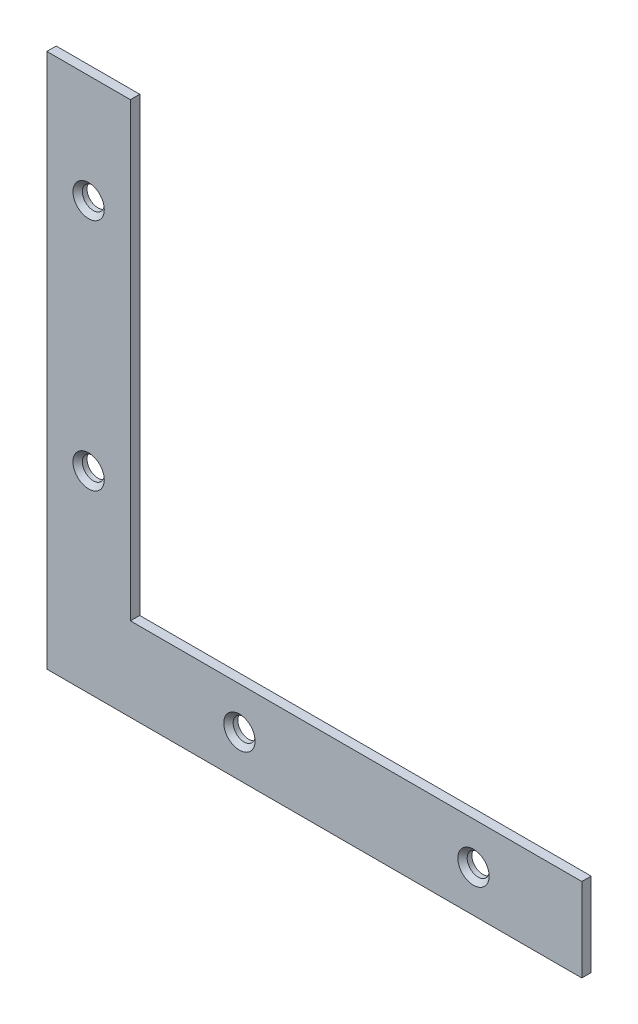
ISO-10303-21;
HEADER;
FILE_DESCRIPTION(('STEP AP214'),'2;1');
FILE_NAME('part.step','',(''),(''),'','','');
FILE_SCHEMA(('AUTOMOTIVE_DESIGN { 1 0 10303 214 1 1 1 1 }'));
ENDSEC;
DATA;
#1=APPLICATION_CONTEXT('core data for automotive mechanical design processes');
#2=APPLICATION_PROTOCOL_DEFINITION('international standard','automotive_design',2000,#1);
#3=PRODUCT_CONTEXT('',#1,'mechanical');
#4=PRODUCT('Part','Part','',(#3));
#5=PRODUCT_RELATED_PRODUCT_CATEGORY('part','',(#4));
#6=PRODUCT_DEFINITION_FORMATION('','',#4);
#7=PRODUCT_DEFINITION_CONTEXT('part definition',#1,'design');
#8=PRODUCT_DEFINITION('design','',#6,#7);
#9=PRODUCT_DEFINITION_SHAPE('','',#8);
#10=(LENGTH_UNIT() NAMED_UNIT(*) SI_UNIT(.MILLI.,.METRE.));
#11=(NAMED_UNIT(*) PLANE_ANGLE_UNIT() SI_UNIT($,.RADIAN.));
#12=(NAMED_UNIT(*) SI_UNIT($,.STERADIAN.) SOLID_ANGLE_UNIT());
#13=UNCERTAINTY_MEASURE_WITH_UNIT(LENGTH_MEASURE(1.E-05),#10,'distance_accuracy_value','');
#14=(GEOMETRIC_REPRESENTATION_CONTEXT(3) GLOBAL_UNCERTAINTY_ASSIGNED_CONTEXT((#13)) GLOBAL_UNIT_ASSIGNED_CONTEXT((#10,
#11,#12)) REPRESENTATION_CONTEXT('',''));
#15=CARTESIAN_POINT('',(0.,0.,0.));
#16=DIRECTION('',(0.,0.,1.));
#17=DIRECTION('',(1.,0.,0.));
#18=AXIS2_PLACEMENT_3D('',#15,#16,#17);
#19=CARTESIAN_POINT('',(0.,101.6,0.889));
#20=DIRECTION('',(0.,0.,1.));
#21=DIRECTION('',(1.,0.,0.));
#22=AXIS2_PLACEMENT_3D('',#19,#20,#21);
#23=PLANE('',#22);
#24=CARTESIAN_POINT('',(7.93749999999997,81.026,0.889));
#25=DIRECTION('',(0.,0.,1.));
#26=DIRECTION('',(1.,0.,0.));
#27=AXIS2_PLACEMENT_3D('',#24,#25,#26);
#28=CIRCLE('',#27,2.97180000000001);
#29=CARTESIAN_POINT('',(10.9093,81.026,0.889));
#30=VERTEX_POINT('',#29);
#31=EDGE_CURVE('E152',#30,#30,#28,.F.);
#32=ORIENTED_EDGE('',*,*,#31,.T.);
#33=EDGE_LOOP('',(#32));
#34=FACE_BOUND('',#33,.T.);
#35=CARTESIAN_POINT('',(7.93749999999999,36.576,0.889));
#36=DIRECTION('',(0.,0.,1.));
#37=DIRECTION('',(1.,0.,0.));
#38=AXIS2_PLACEMENT_3D('',#35,#36,#37);
#39=CIRCLE('',#38,2.9718);
#40=CARTESIAN_POINT('',(10.9093,36.576,0.889));
#41=VERTEX_POINT('',#40);
#42=EDGE_CURVE('E149',#41,#41,#39,.F.);
#43=ORIENTED_EDGE('',*,*,#42,.T.);
#44=EDGE_LOOP('',(#43));
#45=FACE_BOUND('',#44,.T.);
#46=CARTESIAN_POINT('',(81.026,7.9375,0.889));
#47=DIRECTION('',(0.,0.,1.));
#48=DIRECTION('',(1.,0.,0.));
#49=AXIS2_PLACEMENT_3D('',#46,#47,#48);
#50=CIRCLE('',#49,2.97179999999997);
#51=CARTESIAN_POINT('',(83.9978,7.9375,0.889));
#52=VERTEX_POINT('',#51);
#53=EDGE_CURVE('E143',#52,#52,#50,.F.);
#54=ORIENTED_EDGE('',*,*,#53,.T.);
#55=EDGE_LOOP('',(#54));
#56=FACE_BOUND('',#55,.T.);
#57=CARTESIAN_POINT('',(36.576,7.9375,0.889));
#58=DIRECTION('',(0.,0.,1.));
#59=DIRECTION('',(1.,0.,0.));
#60=AXIS2_PLACEMENT_3D('',#57,#58,#59);
#61=CIRCLE('',#60,2.97179999999997);
#62=CARTESIAN_POINT('',(39.5478,7.9375,0.889));
#63=VERTEX_POINT('',#62);
#64=EDGE_CURVE('E140',#63,#63,#61,.F.);
#65=ORIENTED_EDGE('',*,*,#64,.T.);
#66=EDGE_LOOP('',(#65));
#67=FACE_BOUND('',#66,.T.);
#68=DIRECTION('',(-1.,0.,0.));
#69=VECTOR('',#68,1.);
#70=CARTESIAN_POINT('',(15.875,101.6,0.889));
#71=LINE('',#70,#69);
#72=CARTESIAN_POINT('',(15.875,101.6,0.889));
#73=VERTEX_POINT('',#72);
#74=CARTESIAN_POINT('',(0.,101.6,0.889));
#75=VERTEX_POINT('',#74);
#76=EDGE_CURVE('E128',#73,#75,#71,.T.);
#77=ORIENTED_EDGE('',*,*,#76,.T.);
#78=DIRECTION('',(0.,-1.,0.));
#79=VECTOR('',#78,1.);
#80=CARTESIAN_POINT('',(0.,101.6,0.889));
#81=LINE('',#80,#79);
#82=CARTESIAN_POINT('',(0.,0.,0.889));
#83=VERTEX_POINT('',#82);
#84=EDGE_CURVE('E87',#75,#83,#81,.T.);
#85=ORIENTED_EDGE('',*,*,#84,.T.);
#86=DIRECTION('',(1.,0.,0.));
#87=VECTOR('',#86,1.);
#88=CARTESIAN_POINT('',(0.,0.,0.889));
#89=LINE('',#88,#87);
#90=CARTESIAN_POINT('',(101.6,0.,0.889));
#91=VERTEX_POINT('',#90);
#92=EDGE_CURVE('E99',#83,#91,#89,.T.);
#93=ORIENTED_EDGE('',*,*,#92,.T.);
#94=DIRECTION('',(0.,1.,0.));
#95=VECTOR('',#94,1.);
#96=CARTESIAN_POINT('',(101.6,0.,0.889));
#97=LINE('',#96,#95);
#98=CARTESIAN_POINT('',(101.6,15.875,0.889));
#99=VERTEX_POINT('',#98);
#100=EDGE_CURVE('E94',#91,#99,#97,.T.);
#101=ORIENTED_EDGE('',*,*,#100,.T.);
#102=DIRECTION('',(-1.,0.,0.));
#103=VECTOR('',#102,1.);
#104=CARTESIAN_POINT('',(101.6,15.875,0.889));
#105=LINE('',#104,#103);
#106=CARTESIAN_POINT('',(15.875,15.875,0.889));
#107=VERTEX_POINT('',#106);
#108=EDGE_CURVE('E97',#99,#107,#105,.T.);
#109=ORIENTED_EDGE('',*,*,#108,.T.);
#110=DIRECTION('',(0.,1.,0.));
#111=VECTOR('',#110,1.);
#112=CARTESIAN_POINT('',(15.875,15.875,0.889));
#113=LINE('',#112,#111);
#114=EDGE_CURVE('E49',#107,#73,#113,.T.);
#115=ORIENTED_EDGE('',*,*,#114,.T.);
#116=EDGE_LOOP('',(#77,#85,#93,#101,#109,#115));
#117=FACE_BOUND('',#116,.T.);
#118=ADVANCED_FACE('F32',(#34,#45,#56,#67,#117),#23,.T.);
#119=CARTESIAN_POINT('',(0.,101.6,-0.889));
#120=DIRECTION('',(0.,0.,1.));
#121=DIRECTION('',(1.,0.,0.));
#122=AXIS2_PLACEMENT_3D('',#119,#120,#121);
#123=PLANE('',#122);
#124=CARTESIAN_POINT('',(7.93749999999999,36.576,-0.889));
#125=DIRECTION('',(0.,0.,-1.));
#126=DIRECTION('',(0.,1.,0.));
#127=AXIS2_PLACEMENT_3D('',#124,#125,#126);
#128=CIRCLE('',#127,2.0828);
#129=CARTESIAN_POINT('',(7.93749999999998,38.6588,-0.889));
#130=VERTEX_POINT('',#129);
#131=EDGE_CURVE('E195',#130,#130,#128,.T.);
#132=ORIENTED_EDGE('',*,*,#131,.F.);
#133=EDGE_LOOP('',(#132));
#134=FACE_BOUND('',#133,.T.);
#135=CARTESIAN_POINT('',(81.026,7.9375,-0.889));
#136=DIRECTION('',(0.,0.,1.));
#137=DIRECTION('',(1.,0.,0.));
#138=AXIS2_PLACEMENT_3D('',#135,#136,#137);
#139=CIRCLE('',#138,2.0828);
#140=CARTESIAN_POINT('',(83.1088,7.9375,-0.889));
#141=VERTEX_POINT('',#140);
#142=EDGE_CURVE('E192',#141,#141,#139,.T.);
#143=ORIENTED_EDGE('',*,*,#142,.T.);
#144=EDGE_LOOP('',(#143));
#145=FACE_BOUND('',#144,.T.);
#146=CARTESIAN_POINT('',(36.576,7.9375,-0.889));
#147=DIRECTION('',(0.,0.,1.));
#148=DIRECTION('',(1.,0.,0.));
#149=AXIS2_PLACEMENT_3D('',#146,#147,#148);
#150=CIRCLE('',#149,2.0828);
#151=CARTESIAN_POINT('',(38.6588,7.9375,-0.889));
#152=VERTEX_POINT('',#151);
#153=EDGE_CURVE('E121',#152,#152,#150,.T.);
#154=ORIENTED_EDGE('',*,*,#153,.T.);
#155=EDGE_LOOP('',(#154));
#156=FACE_BOUND('',#155,.T.);
#157=DIRECTION('',(-1.,0.,0.));
#158=VECTOR('',#157,1.);
#159=CARTESIAN_POINT('',(15.875,101.6,-0.889));
#160=LINE('',#159,#158);
#161=CARTESIAN_POINT('',(15.875,101.6,-0.889));
#162=VERTEX_POINT('',#161);
#163=CARTESIAN_POINT('',(0.,101.6,-0.889));
#164=VERTEX_POINT('',#163);
#165=EDGE_CURVE('E117',#162,#164,#160,.T.);
#166=ORIENTED_EDGE('',*,*,#165,.F.);
#167=DIRECTION('',(0.,1.,0.));
#168=VECTOR('',#167,1.);
#169=CARTESIAN_POINT('',(15.875,15.875,-0.889));
#170=LINE('',#169,#168);
#171=CARTESIAN_POINT('',(15.875,15.875,-0.889));
#172=VERTEX_POINT('',#171);
#173=EDGE_CURVE('E78',#172,#162,#170,.T.);
#174=ORIENTED_EDGE('',*,*,#173,.F.);
#175=DIRECTION('',(-1.,0.,0.));
#176=VECTOR('',#175,1.);
#177=CARTESIAN_POINT('',(101.6,15.875,-0.889));
#178=LINE('',#177,#176);
#179=CARTESIAN_POINT('',(101.6,15.875,-0.889));
#180=VERTEX_POINT('',#179);
#181=EDGE_CURVE('E72',#180,#172,#178,.T.);
#182=ORIENTED_EDGE('',*,*,#181,.F.);
#183=DIRECTION('',(0.,1.,0.));
#184=VECTOR('',#183,1.);
#185=CARTESIAN_POINT('',(101.6,0.,-0.889));
#186=LINE('',#185,#184);
#187=CARTESIAN_POINT('',(101.6,0.,-0.889));
#188=VERTEX_POINT('',#187);
#189=EDGE_CURVE('E107',#188,#180,#186,.T.);
#190=ORIENTED_EDGE('',*,*,#189,.F.);
#191=DIRECTION('',(1.,0.,0.));
#192=VECTOR('',#191,1.);
#193=CARTESIAN_POINT('',(0.,0.,-0.889));
#194=LINE('',#193,#192);
#195=CARTESIAN_POINT('',(0.,0.,-0.889));
#196=VERTEX_POINT('',#195);
#197=EDGE_CURVE('E123',#196,#188,#194,.T.);
#198=ORIENTED_EDGE('',*,*,#197,.F.);
#199=DIRECTION('',(0.,-1.,0.));
#200=VECTOR('',#199,1.);
#201=CARTESIAN_POINT('',(0.,101.6,-0.889));
#202=LINE('',#201,#200);
#203=EDGE_CURVE('E120',#164,#196,#202,.T.);
#204=ORIENTED_EDGE('',*,*,#203,.F.);
#205=EDGE_LOOP('',(#166,#174,#182,#190,#198,#204));
#206=FACE_BOUND('',#205,.T.);
#207=CARTESIAN_POINT('',(7.93749999999997,81.026,-0.889));
#208=DIRECTION('',(0.,0.,-1.));
#209=DIRECTION('',(0.,1.,0.));
#210=AXIS2_PLACEMENT_3D('',#207,#208,#209);
#211=CIRCLE('',#210,2.0828);
#212=CARTESIAN_POINT('',(7.93749999999996,83.1088,-0.889));
#213=VERTEX_POINT('',#212);
#214=EDGE_CURVE('E246',#213,#213,#211,.T.);
#215=ORIENTED_EDGE('',*,*,#214,.F.);
#216=EDGE_LOOP('',(#215));
#217=FACE_BOUND('',#216,.T.);
#218=ADVANCED_FACE('F167',(#134,#145,#156,#206,#217),#123,.F.);
#219=CARTESIAN_POINT('',(15.875,101.6,0.889));
#220=DIRECTION('',(0.,-1.,0.));
#221=DIRECTION('',(0.,0.,-1.));
#222=AXIS2_PLACEMENT_3D('',#219,#220,#221);
#223=PLANE('',#222);
#224=ORIENTED_EDGE('',*,*,#165,.T.);
#225=DIRECTION('',(0.,0.,-1.));
#226=VECTOR('',#225,1.);
#227=CARTESIAN_POINT('',(0.,101.6,0.889));
#228=LINE('',#227,#226);
#229=EDGE_CURVE('E135',#75,#164,#228,.T.);
#230=ORIENTED_EDGE('',*,*,#229,.F.);
#231=ORIENTED_EDGE('',*,*,#76,.F.);
#232=DIRECTION('',(0.,0.,-1.));
#233=VECTOR('',#232,1.);
#234=CARTESIAN_POINT('',(15.875,101.6,0.889));
#235=LINE('',#234,#233);
#236=EDGE_CURVE('E113',#73,#162,#235,.T.);
#237=ORIENTED_EDGE('',*,*,#236,.T.);
#238=EDGE_LOOP('',(#224,#230,#231,#237));
#239=FACE_BOUND('',#238,.T.);
#240=ADVANCED_FACE('F210',(#239),#223,.F.);
#241=CARTESIAN_POINT('',(0.,101.6,0.889));
#242=DIRECTION('',(1.,0.,0.));
#243=DIRECTION('',(0.,1.,0.));
#244=AXIS2_PLACEMENT_3D('',#241,#242,#243);
#245=PLANE('',#244);
#246=ORIENTED_EDGE('',*,*,#203,.T.);
#247=DIRECTION('',(0.,0.,-1.));
#248=VECTOR('',#247,1.);
#249=CARTESIAN_POINT('',(0.,0.,0.889));
#250=LINE('',#249,#248);
#251=EDGE_CURVE('E132',#83,#196,#250,.T.);
#252=ORIENTED_EDGE('',*,*,#251,.F.);
#253=ORIENTED_EDGE('',*,*,#84,.F.);
#254=ORIENTED_EDGE('',*,*,#229,.T.);
#255=EDGE_LOOP('',(#246,#252,#253,#254));
#256=FACE_BOUND('',#255,.T.);
#257=ADVANCED_FACE('F202',(#256),#245,.F.);
#258=CARTESIAN_POINT('',(0.,0.,0.889));
#259=DIRECTION('',(0.,1.,0.));
#260=DIRECTION('',(0.,0.,1.));
#261=AXIS2_PLACEMENT_3D('',#258,#259,#260);
#262=PLANE('',#261);
#263=ORIENTED_EDGE('',*,*,#197,.T.);
#264=DIRECTION('',(0.,0.,-1.));
#265=VECTOR('',#264,1.);
#266=CARTESIAN_POINT('',(101.6,0.,0.889));
#267=LINE('',#266,#265);
#268=EDGE_CURVE('E108',#91,#188,#267,.T.);
#269=ORIENTED_EDGE('',*,*,#268,.F.);
#270=ORIENTED_EDGE('',*,*,#92,.F.);
#271=ORIENTED_EDGE('',*,*,#251,.T.);
#272=EDGE_LOOP('',(#263,#269,#270,#271));
#273=FACE_BOUND('',#272,.T.);
#274=ADVANCED_FACE('F205',(#273),#262,.F.);
#275=CARTESIAN_POINT('',(101.6,0.,0.889));
#276=DIRECTION('',(-1.,0.,0.));
#277=DIRECTION('',(0.,0.,1.));
#278=AXIS2_PLACEMENT_3D('',#275,#276,#277);
#279=PLANE('',#278);
#280=ORIENTED_EDGE('',*,*,#189,.T.);
#281=DIRECTION('',(0.,0.,-1.));
#282=VECTOR('',#281,1.);
#283=CARTESIAN_POINT('',(101.6,15.875,0.889));
#284=LINE('',#283,#282);
#285=EDGE_CURVE('E104',#99,#180,#284,.T.);
#286=ORIENTED_EDGE('',*,*,#285,.F.);
#287=ORIENTED_EDGE('',*,*,#100,.F.);
#288=ORIENTED_EDGE('',*,*,#268,.T.);
#289=EDGE_LOOP('',(#280,#286,#287,#288));
#290=FACE_BOUND('',#289,.T.);
#291=ADVANCED_FACE('F105',(#290),#279,.F.);
#292=CARTESIAN_POINT('',(101.6,15.875,0.889));
#293=DIRECTION('',(0.,-1.,0.));
#294=DIRECTION('',(1.,0.,0.));
#295=AXIS2_PLACEMENT_3D('',#292,#293,#294);
#296=PLANE('',#295);
#297=ORIENTED_EDGE('',*,*,#181,.T.);
#298=DIRECTION('',(0.,0.,-1.));
#299=VECTOR('',#298,1.);
#300=CARTESIAN_POINT('',(15.875,15.875,0.889));
#301=LINE('',#300,#299);
#302=EDGE_CURVE('E109',#107,#172,#301,.T.);
#303=ORIENTED_EDGE('',*,*,#302,.F.);
#304=ORIENTED_EDGE('',*,*,#108,.F.);
#305=ORIENTED_EDGE('',*,*,#285,.T.);
#306=EDGE_LOOP('',(#297,#303,#304,#305));
#307=FACE_BOUND('',#306,.T.);
#308=ADVANCED_FACE('F111',(#307),#296,.F.);
#309=CARTESIAN_POINT('',(15.875,15.875,0.889));
#310=DIRECTION('',(-1.,0.,0.));
#311=DIRECTION('',(0.,0.,1.));
#312=AXIS2_PLACEMENT_3D('',#309,#310,#311);
#313=PLANE('',#312);
#314=ORIENTED_EDGE('',*,*,#173,.T.);
#315=ORIENTED_EDGE('',*,*,#236,.F.);
#316=ORIENTED_EDGE('',*,*,#114,.F.);
#317=ORIENTED_EDGE('',*,*,#302,.T.);
#318=EDGE_LOOP('',(#314,#315,#316,#317));
#319=FACE_BOUND('',#318,.T.);
#320=ADVANCED_FACE('F187',(#319),#313,.F.);
#321=CARTESIAN_POINT('',(36.576,7.9375,-0.889));
#322=DIRECTION('',(0.,0.,1.));
#323=DIRECTION('',(1.,0.,0.));
#324=AXIS2_PLACEMENT_3D('',#321,#322,#323);
#325=CYLINDRICAL_SURFACE('',#324,2.0828);
#326=CARTESIAN_POINT('',(36.576,7.9375,0.));
#327=DIRECTION('',(0.,0.,1.));
#328=DIRECTION('',(1.,0.,0.));
#329=AXIS2_PLACEMENT_3D('',#326,#327,#328);
#330=CIRCLE('',#329,2.0828);
#331=CARTESIAN_POINT('',(38.6588,7.9375,0.));
#332=VERTEX_POINT('',#331);
#333=EDGE_CURVE('E146',#332,#332,#330,.T.);
#334=ORIENTED_EDGE('',*,*,#333,.T.);
#335=EDGE_LOOP('',(#334));
#336=FACE_BOUND('',#335,.T.);
#337=ORIENTED_EDGE('',*,*,#153,.F.);
#338=EDGE_LOOP('',(#337));
#339=FACE_BOUND('',#338,.T.);
#340=ADVANCED_FACE('F183',(#336,#339),#325,.F.);
#341=CARTESIAN_POINT('',(81.026,7.9375,-0.889));
#342=DIRECTION('',(0.,0.,1.));
#343=DIRECTION('',(1.,0.,0.));
#344=AXIS2_PLACEMENT_3D('',#341,#342,#343);
#345=CYLINDRICAL_SURFACE('',#344,2.0828);
#346=CARTESIAN_POINT('',(81.026,7.9375,0.));
#347=DIRECTION('',(0.,0.,1.));
#348=DIRECTION('',(1.,0.,0.));
#349=AXIS2_PLACEMENT_3D('',#346,#347,#348);
#350=CIRCLE('',#349,2.0828);
#351=CARTESIAN_POINT('',(83.1088,7.9375,0.));
#352=VERTEX_POINT('',#351);
#353=EDGE_CURVE('E137',#352,#352,#350,.T.);
#354=ORIENTED_EDGE('',*,*,#353,.T.);
#355=EDGE_LOOP('',(#354));
#356=FACE_BOUND('',#355,.T.);
#357=ORIENTED_EDGE('',*,*,#142,.F.);
#358=EDGE_LOOP('',(#357));
#359=FACE_BOUND('',#358,.T.);
#360=ADVANCED_FACE('F186',(#356,#359),#345,.F.);
#361=CARTESIAN_POINT('',(81.026,7.9375,0.));
#362=DIRECTION('',(0.,0.,1.));
#363=DIRECTION('',(1.,0.,0.));
#364=AXIS2_PLACEMENT_3D('',#361,#362,#363);
#365=CONICAL_SURFACE('',#364,2.0828,0.785398163397452);
#366=ORIENTED_EDGE('',*,*,#53,.F.);
#367=EDGE_LOOP('',(#366));
#368=FACE_BOUND('',#367,.T.);
#369=ORIENTED_EDGE('',*,*,#353,.F.);
#370=EDGE_LOOP('',(#369));
#371=FACE_BOUND('',#370,.T.);
#372=ADVANCED_FACE('F179',(#368,#371),#365,.F.);
#373=CARTESIAN_POINT('',(36.576,7.9375,0.));
#374=DIRECTION('',(0.,0.,1.));
#375=DIRECTION('',(1.,0.,0.));
#376=AXIS2_PLACEMENT_3D('',#373,#374,#375);
#377=CONICAL_SURFACE('',#376,2.0828,0.785398163397452);
#378=ORIENTED_EDGE('',*,*,#64,.F.);
#379=EDGE_LOOP('',(#378));
#380=FACE_BOUND('',#379,.T.);
#381=ORIENTED_EDGE('',*,*,#333,.F.);
#382=EDGE_LOOP('',(#381));
#383=FACE_BOUND('',#382,.T.);
#384=ADVANCED_FACE('F175',(#380,#383),#377,.F.);
#385=CARTESIAN_POINT('',(7.93749999999999,36.576,-0.889));
#386=DIRECTION('',(0.,0.,1.));
#387=DIRECTION('',(1.,0.,0.));
#388=AXIS2_PLACEMENT_3D('',#385,#386,#387);
#389=CYLINDRICAL_SURFACE('',#388,2.0828);
#390=CARTESIAN_POINT('',(7.93749999999999,36.576,0.));
#391=DIRECTION('',(0.,0.,1.));
#392=DIRECTION('',(1.,0.,0.));
#393=AXIS2_PLACEMENT_3D('',#390,#391,#392);
#394=CIRCLE('',#393,2.0828);
#395=CARTESIAN_POINT('',(10.0203,36.576,0.));
#396=VERTEX_POINT('',#395);
#397=EDGE_CURVE('E11',#396,#396,#394,.T.);
#398=ORIENTED_EDGE('',*,*,#397,.T.);
#399=EDGE_LOOP('',(#398));
#400=FACE_BOUND('',#399,.T.);
#401=ORIENTED_EDGE('',*,*,#131,.T.);
#402=EDGE_LOOP('',(#401));
#403=FACE_BOUND('',#402,.T.);
#404=ADVANCED_FACE('F178',(#400,#403),#389,.F.);
#405=CARTESIAN_POINT('',(7.93749999999997,81.026,-0.889));
#406=DIRECTION('',(0.,0.,1.));
#407=DIRECTION('',(1.,0.,0.));
#408=AXIS2_PLACEMENT_3D('',#405,#406,#407);
#409=CYLINDRICAL_SURFACE('',#408,2.0828);
#410=CARTESIAN_POINT('',(7.93749999999997,81.026,0.));
#411=DIRECTION('',(0.,0.,1.));
#412=DIRECTION('',(1.,0.,0.));
#413=AXIS2_PLACEMENT_3D('',#410,#411,#412);
#414=CIRCLE('',#413,2.0828);
#415=CARTESIAN_POINT('',(10.0203,81.026,0.));
#416=VERTEX_POINT('',#415);
#417=EDGE_CURVE('E41',#416,#416,#414,.T.);
#418=ORIENTED_EDGE('',*,*,#417,.T.);
#419=EDGE_LOOP('',(#418));
#420=FACE_BOUND('',#419,.T.);
#421=ORIENTED_EDGE('',*,*,#214,.T.);
#422=EDGE_LOOP('',(#421));
#423=FACE_BOUND('',#422,.T.);
#424=ADVANCED_FACE('F157',(#420,#423),#409,.F.);
#425=CARTESIAN_POINT('',(7.93749999999997,81.026,0.889));
#426=DIRECTION('',(0.,0.,1.));
#427=DIRECTION('',(1.,0.,0.));
#428=AXIS2_PLACEMENT_3D('',#425,#426,#427);
#429=CONICAL_SURFACE('',#428,2.97180000000001,0.785398163397446);
#430=ORIENTED_EDGE('',*,*,#417,.F.);
#431=EDGE_LOOP('',(#430));
#432=FACE_BOUND('',#431,.T.);
#433=ORIENTED_EDGE('',*,*,#31,.F.);
#434=EDGE_LOOP('',(#433));
#435=FACE_BOUND('',#434,.T.);
#436=ADVANCED_FACE('F160',(#432,#435),#429,.F.);
#437=CARTESIAN_POINT('',(7.93749999999999,36.576,0.889));
#438=DIRECTION('',(0.,0.,1.));
#439=DIRECTION('',(1.,0.,0.));
#440=AXIS2_PLACEMENT_3D('',#437,#438,#439);
#441=CONICAL_SURFACE('',#440,2.9718,0.785398163397442);
#442=ORIENTED_EDGE('',*,*,#397,.F.);
#443=EDGE_LOOP('',(#442));
#444=FACE_BOUND('',#443,.T.);
#445=ORIENTED_EDGE('',*,*,#42,.F.);
#446=EDGE_LOOP('',(#445));
#447=FACE_BOUND('',#446,.T.);
#448=ADVANCED_FACE('F34',(#444,#447),#441,.F.);
#449=CLOSED_SHELL('',(#118,#218,#240,#257,#274,#291,#308,#320,#340,#360,#372,#384,#404,#424,
#436,#448));
#450=MANIFOLD_SOLID_BREP('B2',#449);
#451=ADVANCED_BREP_SHAPE_REPRESENTATION('',(#18,#450),#14);
#452=SHAPE_DEFINITION_REPRESENTATION(#9,#451);
ENDSEC;
END-ISO-10303-21;
